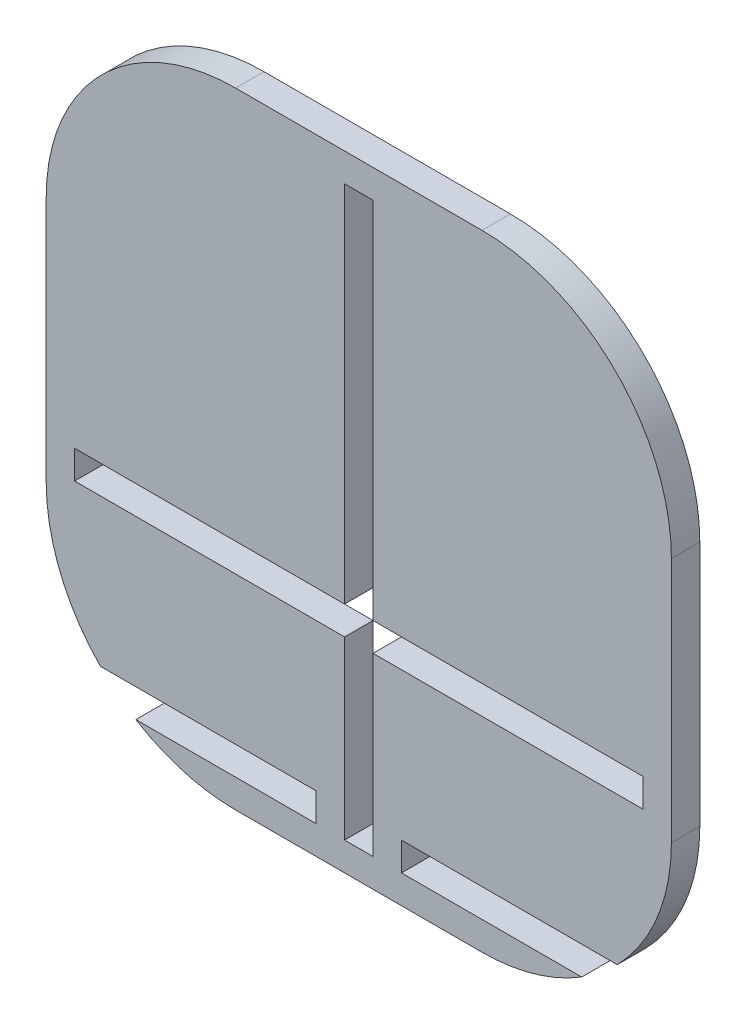
ISO-10303-21;
HEADER;
FILE_DESCRIPTION(('STEP AP214'),'2;1');
FILE_NAME('part.step','',(''),(''),'','','');
FILE_SCHEMA(('AUTOMOTIVE_DESIGN { 1 0 10303 214 1 1 1 1 }'));
ENDSEC;
DATA;
#1=APPLICATION_CONTEXT('core data for automotive mechanical design processes');
#2=APPLICATION_PROTOCOL_DEFINITION('international standard','automotive_design',2000,#1);
#3=PRODUCT_CONTEXT('',#1,'mechanical');
#4=PRODUCT('Part','Part','',(#3));
#5=PRODUCT_RELATED_PRODUCT_CATEGORY('part','',(#4));
#6=PRODUCT_DEFINITION_FORMATION('','',#4);
#7=PRODUCT_DEFINITION_CONTEXT('part definition',#1,'design');
#8=PRODUCT_DEFINITION('design','',#6,#7);
#9=PRODUCT_DEFINITION_SHAPE('','',#8);
#10=(LENGTH_UNIT() NAMED_UNIT(*) SI_UNIT(.MILLI.,.METRE.));
#11=(NAMED_UNIT(*) PLANE_ANGLE_UNIT() SI_UNIT($,.RADIAN.));
#12=(NAMED_UNIT(*) SI_UNIT($,.STERADIAN.) SOLID_ANGLE_UNIT());
#13=UNCERTAINTY_MEASURE_WITH_UNIT(LENGTH_MEASURE(1.E-05),#10,'distance_accuracy_value','');
#14=(GEOMETRIC_REPRESENTATION_CONTEXT(3) GLOBAL_UNCERTAINTY_ASSIGNED_CONTEXT((#13)) GLOBAL_UNIT_ASSIGNED_CONTEXT((#10,
#11,#12)) REPRESENTATION_CONTEXT('',''));
#15=CARTESIAN_POINT('',(0.,0.,0.));
#16=DIRECTION('',(0.,0.,1.));
#17=DIRECTION('',(1.,0.,0.));
#18=AXIS2_PLACEMENT_3D('',#15,#16,#17);
#19=CARTESIAN_POINT('',(0.,33.,3.));
#20=DIRECTION('',(0.,-1.,0.));
#21=DIRECTION('',(1.,0.,0.));
#22=AXIS2_PLACEMENT_3D('',#19,#20,#21);
#23=PLANE('',#22);
#24=DIRECTION('',(-1.,0.,0.));
#25=VECTOR('',#24,1.);
#26=CARTESIAN_POINT('',(0.,33.,0.));
#27=LINE('',#26,#25);
#28=CARTESIAN_POINT('',(12.9999999999999,33.,0.));
#29=VERTEX_POINT('',#28);
#30=CARTESIAN_POINT('',(-12.9999999999999,33.,0.));
#31=VERTEX_POINT('',#30);
#32=EDGE_CURVE('E304',#29,#31,#27,.T.);
#33=ORIENTED_EDGE('',*,*,#32,.T.);
#34=DIRECTION('',(0.,0.,-1.));
#35=VECTOR('',#34,1.);
#36=CARTESIAN_POINT('',(-12.9999999999999,33.,3.));
#37=LINE('',#36,#35);
#38=CARTESIAN_POINT('',(-12.9999999999999,33.,3.));
#39=VERTEX_POINT('',#38);
#40=EDGE_CURVE('E11',#39,#31,#37,.T.);
#41=ORIENTED_EDGE('',*,*,#40,.F.);
#42=DIRECTION('',(-1.,0.,0.));
#43=VECTOR('',#42,1.);
#44=CARTESIAN_POINT('',(0.,33.,3.));
#45=LINE('',#44,#43);
#46=CARTESIAN_POINT('',(12.9999999999999,33.,3.));
#47=VERTEX_POINT('',#46);
#48=EDGE_CURVE('E506',#47,#39,#45,.T.);
#49=ORIENTED_EDGE('',*,*,#48,.F.);
#50=DIRECTION('',(0.,0.,-1.));
#51=VECTOR('',#50,1.);
#52=CARTESIAN_POINT('',(12.9999999999999,33.,3.));
#53=LINE('',#52,#51);
#54=EDGE_CURVE('E356',#47,#29,#53,.T.);
#55=ORIENTED_EDGE('',*,*,#54,.T.);
#56=EDGE_LOOP('',(#33,#41,#49,#55));
#57=FACE_BOUND('',#56,.T.);
#58=ADVANCED_FACE('F45',(#57),#23,.F.);
#59=CARTESIAN_POINT('',(-13.,13.,3.));
#60=DIRECTION('',(0.,0.,-1.));
#61=DIRECTION('',(-1.,0.,0.));
#62=AXIS2_PLACEMENT_3D('',#59,#60,#61);
#63=CYLINDRICAL_SURFACE('',#62,20.);
#64=CARTESIAN_POINT('',(-13.,13.,0.));
#65=DIRECTION('',(0.,0.,1.));
#66=DIRECTION('',(1.,0.,0.));
#67=AXIS2_PLACEMENT_3D('',#64,#65,#66);
#68=CIRCLE('',#67,20.);
#69=CARTESIAN_POINT('',(-33.,12.9999999999998,0.));
#70=VERTEX_POINT('',#69);
#71=EDGE_CURVE('E308',#31,#70,#68,.T.);
#72=ORIENTED_EDGE('',*,*,#71,.T.);
#73=DIRECTION('',(0.,0.,-1.));
#74=VECTOR('',#73,1.);
#75=CARTESIAN_POINT('',(-33.,12.9999999999998,3.));
#76=LINE('',#75,#74);
#77=CARTESIAN_POINT('',(-33.,12.9999999999998,3.));
#78=VERTEX_POINT('',#77);
#79=EDGE_CURVE('E56',#78,#70,#76,.T.);
#80=ORIENTED_EDGE('',*,*,#79,.F.);
#81=CARTESIAN_POINT('',(-13.,13.,3.));
#82=DIRECTION('',(0.,0.,1.));
#83=DIRECTION('',(1.,0.,0.));
#84=AXIS2_PLACEMENT_3D('',#81,#82,#83);
#85=CIRCLE('',#84,20.);
#86=EDGE_CURVE('E509',#39,#78,#85,.T.);
#87=ORIENTED_EDGE('',*,*,#86,.F.);
#88=ORIENTED_EDGE('',*,*,#40,.T.);
#89=EDGE_LOOP('',(#72,#80,#87,#88));
#90=FACE_BOUND('',#89,.T.);
#91=ADVANCED_FACE('F582',(#90),#63,.T.);
#92=CARTESIAN_POINT('',(-33.,0.,3.));
#93=DIRECTION('',(-1.,0.,0.));
#94=DIRECTION('',(0.,0.,1.));
#95=AXIS2_PLACEMENT_3D('',#92,#93,#94);
#96=PLANE('',#95);
#97=DIRECTION('',(0.,1.,0.));
#98=VECTOR('',#97,1.);
#99=CARTESIAN_POINT('',(-33.,0.,0.));
#100=LINE('',#99,#98);
#101=CARTESIAN_POINT('',(-33.,-12.9999999999999,0.));
#102=VERTEX_POINT('',#101);
#103=EDGE_CURVE('E312',#102,#70,#100,.T.);
#104=ORIENTED_EDGE('',*,*,#103,.F.);
#105=DIRECTION('',(0.,0.,-1.));
#106=VECTOR('',#105,1.);
#107=CARTESIAN_POINT('',(-33.,-12.9999999999999,3.));
#108=LINE('',#107,#106);
#109=CARTESIAN_POINT('',(-33.,-12.9999999999999,3.));
#110=VERTEX_POINT('',#109);
#111=EDGE_CURVE('E392',#110,#102,#108,.T.);
#112=ORIENTED_EDGE('',*,*,#111,.F.);
#113=DIRECTION('',(0.,1.,0.));
#114=VECTOR('',#113,1.);
#115=CARTESIAN_POINT('',(-33.,0.,3.));
#116=LINE('',#115,#114);
#117=EDGE_CURVE('E512',#110,#78,#116,.T.);
#118=ORIENTED_EDGE('',*,*,#117,.T.);
#119=ORIENTED_EDGE('',*,*,#79,.T.);
#120=EDGE_LOOP('',(#104,#112,#118,#119));
#121=FACE_BOUND('',#120,.T.);
#122=ADVANCED_FACE('F578',(#121),#96,.T.);
#123=CARTESIAN_POINT('',(-13.,-13.,3.));
#124=DIRECTION('',(0.,0.,-1.));
#125=DIRECTION('',(-1.,0.,0.));
#126=AXIS2_PLACEMENT_3D('',#123,#124,#125);
#127=CYLINDRICAL_SURFACE('',#126,20.);
#128=CARTESIAN_POINT('',(-13.,-13.,0.));
#129=DIRECTION('',(0.,0.,1.));
#130=DIRECTION('',(1.,0.,0.));
#131=AXIS2_PLACEMENT_3D('',#128,#129,#130);
#132=CIRCLE('',#131,20.);
#133=CARTESIAN_POINT('',(-27.2828568570857,-27.,0.));
#134=VERTEX_POINT('',#133);
#135=EDGE_CURVE('E316',#134,#102,#132,.F.);
#136=ORIENTED_EDGE('',*,*,#135,.F.);
#137=DIRECTION('',(0.,0.,-1.));
#138=VECTOR('',#137,1.);
#139=CARTESIAN_POINT('',(-27.2828568570857,-27.,3.));
#140=LINE('',#139,#138);
#141=CARTESIAN_POINT('',(-27.2828568570857,-27.,3.));
#142=VERTEX_POINT('',#141);
#143=EDGE_CURVE('E389',#142,#134,#140,.T.);
#144=ORIENTED_EDGE('',*,*,#143,.F.);
#145=CARTESIAN_POINT('',(-13.,-13.,3.));
#146=DIRECTION('',(0.,0.,1.));
#147=DIRECTION('',(1.,0.,0.));
#148=AXIS2_PLACEMENT_3D('',#145,#146,#147);
#149=CIRCLE('',#148,20.);
#150=EDGE_CURVE('E516',#142,#110,#149,.F.);
#151=ORIENTED_EDGE('',*,*,#150,.T.);
#152=ORIENTED_EDGE('',*,*,#111,.T.);
#153=EDGE_LOOP('',(#136,#144,#151,#152));
#154=FACE_BOUND('',#153,.T.);
#155=ADVANCED_FACE('F572',(#154),#127,.T.);
#156=CARTESIAN_POINT('',(0.,-27.,3.));
#157=DIRECTION('',(0.,1.,0.));
#158=DIRECTION('',(-1.,0.,0.));
#159=AXIS2_PLACEMENT_3D('',#156,#157,#158);
#160=PLANE('',#159);
#161=DIRECTION('',(1.,0.,0.));
#162=VECTOR('',#161,1.);
#163=CARTESIAN_POINT('',(0.,-27.,0.));
#164=LINE('',#163,#162);
#165=CARTESIAN_POINT('',(-4.50285685708569,-27.,0.));
#166=VERTEX_POINT('',#165);
#167=EDGE_CURVE('E320',#134,#166,#164,.T.);
#168=ORIENTED_EDGE('',*,*,#167,.T.);
#169=DIRECTION('',(0.,0.,-1.));
#170=VECTOR('',#169,1.);
#171=CARTESIAN_POINT('',(-4.50285685708569,-27.,3.));
#172=LINE('',#171,#170);
#173=CARTESIAN_POINT('',(-4.50285685708569,-27.,3.));
#174=VERTEX_POINT('',#173);
#175=EDGE_CURVE('E385',#174,#166,#172,.T.);
#176=ORIENTED_EDGE('',*,*,#175,.F.);
#177=DIRECTION('',(1.,0.,0.));
#178=VECTOR('',#177,1.);
#179=CARTESIAN_POINT('',(0.,-27.,3.));
#180=LINE('',#179,#178);
#181=EDGE_CURVE('E520',#142,#174,#180,.T.);
#182=ORIENTED_EDGE('',*,*,#181,.F.);
#183=ORIENTED_EDGE('',*,*,#143,.T.);
#184=EDGE_LOOP('',(#168,#176,#182,#183));
#185=FACE_BOUND('',#184,.T.);
#186=ADVANCED_FACE('F825',(#185),#160,.F.);
#187=CARTESIAN_POINT('',(-4.50285685708569,0.,3.));
#188=DIRECTION('',(1.,0.,0.));
#189=DIRECTION('',(0.,0.,-1.));
#190=AXIS2_PLACEMENT_3D('',#187,#188,#189);
#191=PLANE('',#190);
#192=DIRECTION('',(0.,-1.,0.));
#193=VECTOR('',#192,1.);
#194=CARTESIAN_POINT('',(-4.50285685708569,0.,0.));
#195=LINE('',#194,#193);
#196=CARTESIAN_POINT('',(-4.50285685708569,-30.,0.));
#197=VERTEX_POINT('',#196);
#198=EDGE_CURVE('E324',#166,#197,#195,.T.);
#199=ORIENTED_EDGE('',*,*,#198,.T.);
#200=DIRECTION('',(0.,0.,-1.));
#201=VECTOR('',#200,1.);
#202=CARTESIAN_POINT('',(-4.50285685708569,-30.,3.));
#203=LINE('',#202,#201);
#204=CARTESIAN_POINT('',(-4.50285685708569,-30.,3.));
#205=VERTEX_POINT('',#204);
#206=EDGE_CURVE('E382',#205,#197,#203,.T.);
#207=ORIENTED_EDGE('',*,*,#206,.F.);
#208=DIRECTION('',(0.,-1.,0.));
#209=VECTOR('',#208,1.);
#210=CARTESIAN_POINT('',(-4.50285685708569,0.,3.));
#211=LINE('',#210,#209);
#212=EDGE_CURVE('E524',#174,#205,#211,.T.);
#213=ORIENTED_EDGE('',*,*,#212,.F.);
#214=ORIENTED_EDGE('',*,*,#175,.T.);
#215=EDGE_LOOP('',(#199,#207,#213,#214));
#216=FACE_BOUND('',#215,.T.);
#217=ADVANCED_FACE('F566',(#216),#191,.F.);
#218=CARTESIAN_POINT('',(0.,-30.,3.));
#219=DIRECTION('',(0.,1.,0.));
#220=DIRECTION('',(-1.,0.,0.));
#221=AXIS2_PLACEMENT_3D('',#218,#219,#220);
#222=PLANE('',#221);
#223=DIRECTION('',(1.,0.,0.));
#224=VECTOR('',#223,1.);
#225=CARTESIAN_POINT('',(0.,-30.,0.));
#226=LINE('',#225,#224);
#227=CARTESIAN_POINT('',(-23.5356537528527,-30.,0.));
#228=VERTEX_POINT('',#227);
#229=EDGE_CURVE('E328',#228,#197,#226,.T.);
#230=ORIENTED_EDGE('',*,*,#229,.F.);
#231=DIRECTION('',(0.,0.,-1.));
#232=VECTOR('',#231,1.);
#233=CARTESIAN_POINT('',(-23.5356537528527,-30.,3.));
#234=LINE('',#233,#232);
#235=CARTESIAN_POINT('',(-23.5356537528527,-30.,3.));
#236=VERTEX_POINT('',#235);
#237=EDGE_CURVE('E379',#236,#228,#234,.T.);
#238=ORIENTED_EDGE('',*,*,#237,.F.);
#239=DIRECTION('',(1.,0.,0.));
#240=VECTOR('',#239,1.);
#241=CARTESIAN_POINT('',(0.,-30.,3.));
#242=LINE('',#241,#240);
#243=EDGE_CURVE('E527',#236,#205,#242,.T.);
#244=ORIENTED_EDGE('',*,*,#243,.T.);
#245=ORIENTED_EDGE('',*,*,#206,.T.);
#246=EDGE_LOOP('',(#230,#238,#244,#245));
#247=FACE_BOUND('',#246,.T.);
#248=ADVANCED_FACE('F562',(#247),#222,.T.);
#249=CARTESIAN_POINT('',(-12.9999999999999,-33.,0.));
#250=VERTEX_POINT('',#249);
#251=EDGE_CURVE('E321',#250,#228,#132,.F.);
#252=ORIENTED_EDGE('',*,*,#251,.F.);
#253=DIRECTION('',(0.,0.,-1.));
#254=VECTOR('',#253,1.);
#255=CARTESIAN_POINT('',(-12.9999999999999,-33.,3.));
#256=LINE('',#255,#254);
#257=CARTESIAN_POINT('',(-12.9999999999999,-33.,3.));
#258=VERTEX_POINT('',#257);
#259=EDGE_CURVE('E376',#258,#250,#256,.T.);
#260=ORIENTED_EDGE('',*,*,#259,.F.);
#261=EDGE_CURVE('E521',#258,#236,#149,.F.);
#262=ORIENTED_EDGE('',*,*,#261,.T.);
#263=ORIENTED_EDGE('',*,*,#237,.T.);
#264=EDGE_LOOP('',(#252,#260,#262,#263));
#265=FACE_BOUND('',#264,.T.);
#266=ADVANCED_FACE('F557',(#265),#127,.T.);
#267=CARTESIAN_POINT('',(0.,-33.,3.));
#268=DIRECTION('',(0.,-1.,0.));
#269=DIRECTION('',(1.,0.,0.));
#270=AXIS2_PLACEMENT_3D('',#267,#268,#269);
#271=PLANE('',#270);
#272=DIRECTION('',(-1.,0.,0.));
#273=VECTOR('',#272,1.);
#274=CARTESIAN_POINT('',(0.,-33.,0.));
#275=LINE('',#274,#273);
#276=CARTESIAN_POINT('',(12.9999999999999,-33.,0.));
#277=VERTEX_POINT('',#276);
#278=EDGE_CURVE('E332',#277,#250,#275,.T.);
#279=ORIENTED_EDGE('',*,*,#278,.F.);
#280=DIRECTION('',(0.,0.,-1.));
#281=VECTOR('',#280,1.);
#282=CARTESIAN_POINT('',(12.9999999999999,-33.,3.));
#283=LINE('',#282,#281);
#284=CARTESIAN_POINT('',(12.9999999999999,-33.,3.));
#285=VERTEX_POINT('',#284);
#286=EDGE_CURVE('E373',#285,#277,#283,.T.);
#287=ORIENTED_EDGE('',*,*,#286,.F.);
#288=DIRECTION('',(-1.,0.,0.));
#289=VECTOR('',#288,1.);
#290=CARTESIAN_POINT('',(0.,-33.,3.));
#291=LINE('',#290,#289);
#292=EDGE_CURVE('E531',#285,#258,#291,.T.);
#293=ORIENTED_EDGE('',*,*,#292,.T.);
#294=ORIENTED_EDGE('',*,*,#259,.T.);
#295=EDGE_LOOP('',(#279,#287,#293,#294));
#296=FACE_BOUND('',#295,.T.);
#297=ADVANCED_FACE('F791',(#296),#271,.T.);
#298=CARTESIAN_POINT('',(13.,-13.,3.));
#299=DIRECTION('',(0.,0.,-1.));
#300=DIRECTION('',(-1.,0.,0.));
#301=AXIS2_PLACEMENT_3D('',#298,#299,#300);
#302=CYLINDRICAL_SURFACE('',#301,20.);
#303=CARTESIAN_POINT('',(13.,-13.,0.));
#304=DIRECTION('',(0.,0.,1.));
#305=DIRECTION('',(1.,0.,0.));
#306=AXIS2_PLACEMENT_3D('',#303,#304,#305);
#307=CIRCLE('',#306,20.);
#308=CARTESIAN_POINT('',(23.5356537528527,-30.,0.));
#309=VERTEX_POINT('',#308);
#310=EDGE_CURVE('E336',#277,#309,#307,.T.);
#311=ORIENTED_EDGE('',*,*,#310,.T.);
#312=DIRECTION('',(0.,0.,-1.));
#313=VECTOR('',#312,1.);
#314=CARTESIAN_POINT('',(23.5356537528527,-30.,3.));
#315=LINE('',#314,#313);
#316=CARTESIAN_POINT('',(23.5356537528527,-30.,3.));
#317=VERTEX_POINT('',#316);
#318=EDGE_CURVE('E369',#317,#309,#315,.T.);
#319=ORIENTED_EDGE('',*,*,#318,.F.);
#320=CARTESIAN_POINT('',(13.,-13.,3.));
#321=DIRECTION('',(0.,0.,1.));
#322=DIRECTION('',(1.,0.,0.));
#323=AXIS2_PLACEMENT_3D('',#320,#321,#322);
#324=CIRCLE('',#323,20.);
#325=EDGE_CURVE('E255',#285,#317,#324,.T.);
#326=ORIENTED_EDGE('',*,*,#325,.F.);
#327=ORIENTED_EDGE('',*,*,#286,.T.);
#328=EDGE_LOOP('',(#311,#319,#326,#327));
#329=FACE_BOUND('',#328,.T.);
#330=ADVANCED_FACE('F756',(#329),#302,.T.);
#331=CARTESIAN_POINT('',(0.,-30.,3.));
#332=DIRECTION('',(0.,-1.,0.));
#333=DIRECTION('',(1.,0.,0.));
#334=AXIS2_PLACEMENT_3D('',#331,#332,#333);
#335=PLANE('',#334);
#336=DIRECTION('',(-1.,0.,0.));
#337=VECTOR('',#336,1.);
#338=CARTESIAN_POINT('',(0.,-30.,0.));
#339=LINE('',#338,#337);
#340=CARTESIAN_POINT('',(4.5028568570857,-30.,0.));
#341=VERTEX_POINT('',#340);
#342=EDGE_CURVE('E339',#309,#341,#339,.T.);
#343=ORIENTED_EDGE('',*,*,#342,.T.);
#344=DIRECTION('',(0.,0.,-1.));
#345=VECTOR('',#344,1.);
#346=CARTESIAN_POINT('',(4.5028568570857,-30.,3.));
#347=LINE('',#346,#345);
#348=CARTESIAN_POINT('',(4.5028568570857,-30.,3.));
#349=VERTEX_POINT('',#348);
#350=EDGE_CURVE('E366',#349,#341,#347,.T.);
#351=ORIENTED_EDGE('',*,*,#350,.F.);
#352=DIRECTION('',(-1.,0.,0.));
#353=VECTOR('',#352,1.);
#354=CARTESIAN_POINT('',(0.,-30.,3.));
#355=LINE('',#354,#353);
#356=EDGE_CURVE('E536',#317,#349,#355,.T.);
#357=ORIENTED_EDGE('',*,*,#356,.F.);
#358=ORIENTED_EDGE('',*,*,#318,.T.);
#359=EDGE_LOOP('',(#343,#351,#357,#358));
#360=FACE_BOUND('',#359,.T.);
#361=ADVANCED_FACE('F773',(#360),#335,.F.);
#362=CARTESIAN_POINT('',(4.5028568570857,0.,3.));
#363=DIRECTION('',(1.,0.,0.));
#364=DIRECTION('',(0.,0.,-1.));
#365=AXIS2_PLACEMENT_3D('',#362,#363,#364);
#366=PLANE('',#365);
#367=DIRECTION('',(0.,-1.,0.));
#368=VECTOR('',#367,1.);
#369=CARTESIAN_POINT('',(4.5028568570857,0.,0.));
#370=LINE('',#369,#368);
#371=CARTESIAN_POINT('',(4.5028568570857,-27.,0.));
#372=VERTEX_POINT('',#371);
#373=EDGE_CURVE('E343',#372,#341,#370,.T.);
#374=ORIENTED_EDGE('',*,*,#373,.F.);
#375=DIRECTION('',(0.,0.,-1.));
#376=VECTOR('',#375,1.);
#377=CARTESIAN_POINT('',(4.5028568570857,-27.,3.));
#378=LINE('',#377,#376);
#379=CARTESIAN_POINT('',(4.5028568570857,-27.,3.));
#380=VERTEX_POINT('',#379);
#381=EDGE_CURVE('E363',#380,#372,#378,.T.);
#382=ORIENTED_EDGE('',*,*,#381,.F.);
#383=DIRECTION('',(0.,-1.,0.));
#384=VECTOR('',#383,1.);
#385=CARTESIAN_POINT('',(4.5028568570857,0.,3.));
#386=LINE('',#385,#384);
#387=EDGE_CURVE('E538',#380,#349,#386,.T.);
#388=ORIENTED_EDGE('',*,*,#387,.T.);
#389=ORIENTED_EDGE('',*,*,#350,.T.);
#390=EDGE_LOOP('',(#374,#382,#388,#389));
#391=FACE_BOUND('',#390,.T.);
#392=ADVANCED_FACE('F764',(#391),#366,.T.);
#393=CARTESIAN_POINT('',(0.,-27.,3.));
#394=DIRECTION('',(0.,-1.,0.));
#395=DIRECTION('',(1.,0.,0.));
#396=AXIS2_PLACEMENT_3D('',#393,#394,#395);
#397=PLANE('',#396);
#398=DIRECTION('',(-1.,0.,0.));
#399=VECTOR('',#398,1.);
#400=CARTESIAN_POINT('',(0.,-27.,0.));
#401=LINE('',#400,#399);
#402=CARTESIAN_POINT('',(27.2828568570857,-27.,0.));
#403=VERTEX_POINT('',#402);
#404=EDGE_CURVE('E347',#403,#372,#401,.T.);
#405=ORIENTED_EDGE('',*,*,#404,.F.);
#406=DIRECTION('',(0.,0.,-1.));
#407=VECTOR('',#406,1.);
#408=CARTESIAN_POINT('',(27.2828568570857,-27.,3.));
#409=LINE('',#408,#407);
#410=CARTESIAN_POINT('',(27.2828568570857,-27.,3.));
#411=VERTEX_POINT('',#410);
#412=EDGE_CURVE('E261',#411,#403,#409,.T.);
#413=ORIENTED_EDGE('',*,*,#412,.F.);
#414=DIRECTION('',(-1.,0.,0.));
#415=VECTOR('',#414,1.);
#416=CARTESIAN_POINT('',(0.,-27.,3.));
#417=LINE('',#416,#415);
#418=EDGE_CURVE('E251',#411,#380,#417,.T.);
#419=ORIENTED_EDGE('',*,*,#418,.T.);
#420=ORIENTED_EDGE('',*,*,#381,.T.);
#421=EDGE_LOOP('',(#405,#413,#419,#420));
#422=FACE_BOUND('',#421,.T.);
#423=ADVANCED_FACE('F545',(#422),#397,.T.);
#424=CARTESIAN_POINT('',(33.,-12.9999999999999,0.));
#425=VERTEX_POINT('',#424);
#426=EDGE_CURVE('E259',#403,#425,#307,.T.);
#427=ORIENTED_EDGE('',*,*,#426,.T.);
#428=DIRECTION('',(0.,0.,-1.));
#429=VECTOR('',#428,1.);
#430=CARTESIAN_POINT('',(33.,-12.9999999999999,3.));
#431=LINE('',#430,#429);
#432=CARTESIAN_POINT('',(33.,-12.9999999999999,3.));
#433=VERTEX_POINT('',#432);
#434=EDGE_CURVE('E256',#433,#425,#431,.T.);
#435=ORIENTED_EDGE('',*,*,#434,.F.);
#436=EDGE_CURVE('E244',#411,#433,#324,.T.);
#437=ORIENTED_EDGE('',*,*,#436,.F.);
#438=ORIENTED_EDGE('',*,*,#412,.T.);
#439=EDGE_LOOP('',(#427,#435,#437,#438));
#440=FACE_BOUND('',#439,.T.);
#441=ADVANCED_FACE('F257',(#440),#302,.T.);
#442=CARTESIAN_POINT('',(33.,0.,3.));
#443=DIRECTION('',(-1.,0.,0.));
#444=DIRECTION('',(0.,0.,1.));
#445=AXIS2_PLACEMENT_3D('',#442,#443,#444);
#446=PLANE('',#445);
#447=DIRECTION('',(0.,1.,0.));
#448=VECTOR('',#447,1.);
#449=CARTESIAN_POINT('',(33.,0.,0.));
#450=LINE('',#449,#448);
#451=CARTESIAN_POINT('',(33.,12.9999999999999,0.));
#452=VERTEX_POINT('',#451);
#453=EDGE_CURVE('E154',#425,#452,#450,.T.);
#454=ORIENTED_EDGE('',*,*,#453,.T.);
#455=DIRECTION('',(0.,0.,-1.));
#456=VECTOR('',#455,1.);
#457=CARTESIAN_POINT('',(33.,12.9999999999999,3.));
#458=LINE('',#457,#456);
#459=CARTESIAN_POINT('',(33.,12.9999999999999,3.));
#460=VERTEX_POINT('',#459);
#461=EDGE_CURVE('E262',#460,#452,#458,.T.);
#462=ORIENTED_EDGE('',*,*,#461,.F.);
#463=DIRECTION('',(0.,1.,0.));
#464=VECTOR('',#463,1.);
#465=CARTESIAN_POINT('',(33.,0.,3.));
#466=LINE('',#465,#464);
#467=EDGE_CURVE('E248',#433,#460,#466,.T.);
#468=ORIENTED_EDGE('',*,*,#467,.F.);
#469=ORIENTED_EDGE('',*,*,#434,.T.);
#470=EDGE_LOOP('',(#454,#462,#468,#469));
#471=FACE_BOUND('',#470,.T.);
#472=ADVANCED_FACE('F264',(#471),#446,.F.);
#473=CARTESIAN_POINT('',(0.,30.,3.));
#474=DIRECTION('',(0.,1.,0.));
#475=DIRECTION('',(0.,0.,1.));
#476=AXIS2_PLACEMENT_3D('',#473,#474,#475);
#477=PLANE('',#476);
#478=DIRECTION('',(1.,0.,0.));
#479=VECTOR('',#478,1.);
#480=CARTESIAN_POINT('',(0.,30.,0.));
#481=LINE('',#480,#479);
#482=CARTESIAN_POINT('',(-1.50000000000001,30.,0.));
#483=VERTEX_POINT('',#482);
#484=CARTESIAN_POINT('',(1.50000000000001,30.,0.));
#485=VERTEX_POINT('',#484);
#486=EDGE_CURVE('E273',#483,#485,#481,.T.);
#487=ORIENTED_EDGE('',*,*,#486,.T.);
#488=DIRECTION('',(0.,0.,-1.));
#489=VECTOR('',#488,1.);
#490=CARTESIAN_POINT('',(1.50000000000001,30.,3.));
#491=LINE('',#490,#489);
#492=CARTESIAN_POINT('',(1.50000000000001,30.,3.));
#493=VERTEX_POINT('',#492);
#494=EDGE_CURVE('E49',#493,#485,#491,.T.);
#495=ORIENTED_EDGE('',*,*,#494,.F.);
#496=DIRECTION('',(1.,0.,0.));
#497=VECTOR('',#496,1.);
#498=CARTESIAN_POINT('',(0.,30.,3.));
#499=LINE('',#498,#497);
#500=CARTESIAN_POINT('',(-1.50000000000001,30.,3.));
#501=VERTEX_POINT('',#500);
#502=EDGE_CURVE('E355',#501,#493,#499,.T.);
#503=ORIENTED_EDGE('',*,*,#502,.F.);
#504=DIRECTION('',(0.,0.,-1.));
#505=VECTOR('',#504,1.);
#506=CARTESIAN_POINT('',(-1.50000000000001,30.,3.));
#507=LINE('',#506,#505);
#508=EDGE_CURVE('E268',#501,#483,#507,.T.);
#509=ORIENTED_EDGE('',*,*,#508,.T.);
#510=EDGE_LOOP('',(#487,#495,#503,#509));
#511=FACE_BOUND('',#510,.T.);
#512=ADVANCED_FACE('F47',(#511),#477,.F.);
#513=CARTESIAN_POINT('',(1.50000000000001,0.,3.));
#514=DIRECTION('',(1.,0.,0.));
#515=DIRECTION('',(0.,0.,-1.));
#516=AXIS2_PLACEMENT_3D('',#513,#514,#515);
#517=PLANE('',#516);
#518=DIRECTION('',(0.,-1.,0.));
#519=VECTOR('',#518,1.);
#520=CARTESIAN_POINT('',(1.50000000000001,0.,0.));
#521=LINE('',#520,#519);
#522=CARTESIAN_POINT('',(1.50000000000001,-8.42500000000001,0.));
#523=VERTEX_POINT('',#522);
#524=EDGE_CURVE('E277',#485,#523,#521,.T.);
#525=ORIENTED_EDGE('',*,*,#524,.T.);
#526=DIRECTION('',(0.,0.,-1.));
#527=VECTOR('',#526,1.);
#528=CARTESIAN_POINT('',(1.50000000000001,-8.42500000000001,3.));
#529=LINE('',#528,#527);
#530=CARTESIAN_POINT('',(1.50000000000001,-8.42500000000001,3.));
#531=VERTEX_POINT('',#530);
#532=EDGE_CURVE('E430',#531,#523,#529,.T.);
#533=ORIENTED_EDGE('',*,*,#532,.F.);
#534=DIRECTION('',(0.,-1.,0.));
#535=VECTOR('',#534,1.);
#536=CARTESIAN_POINT('',(1.50000000000001,0.,3.));
#537=LINE('',#536,#535);
#538=EDGE_CURVE('E169',#493,#531,#537,.T.);
#539=ORIENTED_EDGE('',*,*,#538,.F.);
#540=ORIENTED_EDGE('',*,*,#494,.T.);
#541=EDGE_LOOP('',(#525,#533,#539,#540));
#542=FACE_BOUND('',#541,.T.);
#543=ADVANCED_FACE('F438',(#542),#517,.F.);
#544=CARTESIAN_POINT('',(0.,-8.42500000000001,3.));
#545=DIRECTION('',(0.,1.,0.));
#546=DIRECTION('',(0.,0.,1.));
#547=AXIS2_PLACEMENT_3D('',#544,#545,#546);
#548=PLANE('',#547);
#549=DIRECTION('',(1.,0.,0.));
#550=VECTOR('',#549,1.);
#551=CARTESIAN_POINT('',(0.,-8.42500000000001,0.));
#552=LINE('',#551,#550);
#553=CARTESIAN_POINT('',(30.,-8.42500000000001,0.));
#554=VERTEX_POINT('',#553);
#555=EDGE_CURVE('E280',#523,#554,#552,.T.);
#556=ORIENTED_EDGE('',*,*,#555,.T.);
#557=DIRECTION('',(0.,0.,-1.));
#558=VECTOR('',#557,1.);
#559=CARTESIAN_POINT('',(30.,-8.42500000000001,3.));
#560=LINE('',#559,#558);
#561=CARTESIAN_POINT('',(30.,-8.42500000000001,3.));
#562=VERTEX_POINT('',#561);
#563=EDGE_CURVE('E427',#562,#554,#560,.T.);
#564=ORIENTED_EDGE('',*,*,#563,.F.);
#565=DIRECTION('',(1.,0.,0.));
#566=VECTOR('',#565,1.);
#567=CARTESIAN_POINT('',(0.,-8.42500000000001,3.));
#568=LINE('',#567,#566);
#569=EDGE_CURVE('E632',#531,#562,#568,.T.);
#570=ORIENTED_EDGE('',*,*,#569,.F.);
#571=ORIENTED_EDGE('',*,*,#532,.T.);
#572=EDGE_LOOP('',(#556,#564,#570,#571));
#573=FACE_BOUND('',#572,.T.);
#574=ADVANCED_FACE('F607',(#573),#548,.F.);
#575=CARTESIAN_POINT('',(30.,0.,3.));
#576=DIRECTION('',(1.,0.,0.));
#577=DIRECTION('',(0.,0.,-1.));
#578=AXIS2_PLACEMENT_3D('',#575,#576,#577);
#579=PLANE('',#578);
#580=DIRECTION('',(0.,-1.,0.));
#581=VECTOR('',#580,1.);
#582=CARTESIAN_POINT('',(30.,0.,0.));
#583=LINE('',#582,#581);
#584=CARTESIAN_POINT('',(30.,-11.425,0.));
#585=VERTEX_POINT('',#584);
#586=EDGE_CURVE('E284',#554,#585,#583,.T.);
#587=ORIENTED_EDGE('',*,*,#586,.T.);
#588=DIRECTION('',(0.,0.,-1.));
#589=VECTOR('',#588,1.);
#590=CARTESIAN_POINT('',(30.,-11.425,3.));
#591=LINE('',#590,#589);
#592=CARTESIAN_POINT('',(30.,-11.425,3.));
#593=VERTEX_POINT('',#592);
#594=EDGE_CURVE('E423',#593,#585,#591,.T.);
#595=ORIENTED_EDGE('',*,*,#594,.F.);
#596=DIRECTION('',(0.,-1.,0.));
#597=VECTOR('',#596,1.);
#598=CARTESIAN_POINT('',(30.,0.,3.));
#599=LINE('',#598,#597);
#600=EDGE_CURVE('E630',#562,#593,#599,.T.);
#601=ORIENTED_EDGE('',*,*,#600,.F.);
#602=ORIENTED_EDGE('',*,*,#563,.T.);
#603=EDGE_LOOP('',(#587,#595,#601,#602));
#604=FACE_BOUND('',#603,.T.);
#605=ADVANCED_FACE('F616',(#604),#579,.F.);
#606=CARTESIAN_POINT('',(0.,-11.425,3.));
#607=DIRECTION('',(0.,-1.,0.));
#608=DIRECTION('',(0.,0.,-1.));
#609=AXIS2_PLACEMENT_3D('',#606,#607,#608);
#610=PLANE('',#609);
#611=DIRECTION('',(-1.,0.,0.));
#612=VECTOR('',#611,1.);
#613=CARTESIAN_POINT('',(0.,-11.425,0.));
#614=LINE('',#613,#612);
#615=CARTESIAN_POINT('',(1.50000000000001,-11.425,0.));
#616=VERTEX_POINT('',#615);
#617=EDGE_CURVE('E288',#585,#616,#614,.T.);
#618=ORIENTED_EDGE('',*,*,#617,.T.);
#619=DIRECTION('',(0.,0.,-1.));
#620=VECTOR('',#619,1.);
#621=CARTESIAN_POINT('',(1.50000000000001,-11.425,3.));
#622=LINE('',#621,#620);
#623=CARTESIAN_POINT('',(1.50000000000001,-11.425,3.));
#624=VERTEX_POINT('',#623);
#625=EDGE_CURVE('E419',#624,#616,#622,.T.);
#626=ORIENTED_EDGE('',*,*,#625,.F.);
#627=DIRECTION('',(-1.,0.,0.));
#628=VECTOR('',#627,1.);
#629=CARTESIAN_POINT('',(0.,-11.425,3.));
#630=LINE('',#629,#628);
#631=EDGE_CURVE('E498',#593,#624,#630,.T.);
#632=ORIENTED_EDGE('',*,*,#631,.F.);
#633=ORIENTED_EDGE('',*,*,#594,.T.);
#634=EDGE_LOOP('',(#618,#626,#632,#633));
#635=FACE_BOUND('',#634,.T.);
#636=ADVANCED_FACE('F612',(#635),#610,.F.);
#637=CARTESIAN_POINT('',(1.50000000000001,-30.,0.));
#638=VERTEX_POINT('',#637);
#639=EDGE_CURVE('E281',#616,#638,#521,.T.);
#640=ORIENTED_EDGE('',*,*,#639,.T.);
#641=DIRECTION('',(0.,0.,-1.));
#642=VECTOR('',#641,1.);
#643=CARTESIAN_POINT('',(1.50000000000001,-30.,3.));
#644=LINE('',#643,#642);
#645=CARTESIAN_POINT('',(1.50000000000001,-30.,3.));
#646=VERTEX_POINT('',#645);
#647=EDGE_CURVE('E416',#646,#638,#644,.T.);
#648=ORIENTED_EDGE('',*,*,#647,.F.);
#649=EDGE_CURVE('E492',#624,#646,#537,.T.);
#650=ORIENTED_EDGE('',*,*,#649,.F.);
#651=ORIENTED_EDGE('',*,*,#625,.T.);
#652=EDGE_LOOP('',(#640,#648,#650,#651));
#653=FACE_BOUND('',#652,.T.);
#654=ADVANCED_FACE('F478',(#653),#517,.F.);
#655=CARTESIAN_POINT('',(0.,-30.,3.));
#656=DIRECTION('',(0.,1.,0.));
#657=DIRECTION('',(0.,0.,1.));
#658=AXIS2_PLACEMENT_3D('',#655,#656,#657);
#659=PLANE('',#658);
#660=DIRECTION('',(1.,0.,0.));
#661=VECTOR('',#660,1.);
#662=CARTESIAN_POINT('',(0.,-30.,0.));
#663=LINE('',#662,#661);
#664=CARTESIAN_POINT('',(-1.50000000000001,-30.,0.));
#665=VERTEX_POINT('',#664);
#666=EDGE_CURVE('E292',#665,#638,#663,.T.);
#667=ORIENTED_EDGE('',*,*,#666,.F.);
#668=DIRECTION('',(0.,0.,-1.));
#669=VECTOR('',#668,1.);
#670=CARTESIAN_POINT('',(-1.50000000000001,-30.,3.));
#671=LINE('',#670,#669);
#672=CARTESIAN_POINT('',(-1.50000000000001,-30.,3.));
#673=VERTEX_POINT('',#672);
#674=EDGE_CURVE('E413',#673,#665,#671,.T.);
#675=ORIENTED_EDGE('',*,*,#674,.F.);
#676=DIRECTION('',(1.,0.,0.));
#677=VECTOR('',#676,1.);
#678=CARTESIAN_POINT('',(0.,-30.,3.));
#679=LINE('',#678,#677);
#680=EDGE_CURVE('E487',#673,#646,#679,.T.);
#681=ORIENTED_EDGE('',*,*,#680,.T.);
#682=ORIENTED_EDGE('',*,*,#647,.T.);
#683=EDGE_LOOP('',(#667,#675,#681,#682));
#684=FACE_BOUND('',#683,.T.);
#685=ADVANCED_FACE('F485',(#684),#659,.T.);
#686=CARTESIAN_POINT('',(-1.50000000000001,0.,3.));
#687=DIRECTION('',(1.,0.,0.));
#688=DIRECTION('',(0.,0.,-1.));
#689=AXIS2_PLACEMENT_3D('',#686,#687,#688);
#690=PLANE('',#689);
#691=DIRECTION('',(0.,-1.,0.));
#692=VECTOR('',#691,1.);
#693=CARTESIAN_POINT('',(-1.50000000000001,0.,0.));
#694=LINE('',#693,#692);
#695=CARTESIAN_POINT('',(-1.50000000000001,-11.425,0.));
#696=VERTEX_POINT('',#695);
#697=EDGE_CURVE('E296',#696,#665,#694,.T.);
#698=ORIENTED_EDGE('',*,*,#697,.F.);
#699=DIRECTION('',(0.,0.,-1.));
#700=VECTOR('',#699,1.);
#701=CARTESIAN_POINT('',(-1.50000000000001,-11.425,3.));
#702=LINE('',#701,#700);
#703=CARTESIAN_POINT('',(-1.50000000000001,-11.425,3.));
#704=VERTEX_POINT('',#703);
#705=EDGE_CURVE('E410',#704,#696,#702,.T.);
#706=ORIENTED_EDGE('',*,*,#705,.F.);
#707=DIRECTION('',(0.,-1.,0.));
#708=VECTOR('',#707,1.);
#709=CARTESIAN_POINT('',(-1.50000000000001,0.,3.));
#710=LINE('',#709,#708);
#711=EDGE_CURVE('E491',#704,#673,#710,.T.);
#712=ORIENTED_EDGE('',*,*,#711,.T.);
#713=ORIENTED_EDGE('',*,*,#674,.T.);
#714=EDGE_LOOP('',(#698,#706,#712,#713));
#715=FACE_BOUND('',#714,.T.);
#716=ADVANCED_FACE('F594',(#715),#690,.T.);
#717=CARTESIAN_POINT('',(-30.,-11.425,0.));
#718=VERTEX_POINT('',#717);
#719=EDGE_CURVE('E291',#696,#718,#614,.T.);
#720=ORIENTED_EDGE('',*,*,#719,.T.);
#721=DIRECTION('',(0.,0.,-1.));
#722=VECTOR('',#721,1.);
#723=CARTESIAN_POINT('',(-30.,-11.425,3.));
#724=LINE('',#723,#722);
#725=CARTESIAN_POINT('',(-30.,-11.425,3.));
#726=VERTEX_POINT('',#725);
#727=EDGE_CURVE('E406',#726,#718,#724,.T.);
#728=ORIENTED_EDGE('',*,*,#727,.F.);
#729=EDGE_CURVE('E470',#704,#726,#630,.T.);
#730=ORIENTED_EDGE('',*,*,#729,.F.);
#731=ORIENTED_EDGE('',*,*,#705,.T.);
#732=EDGE_LOOP('',(#720,#728,#730,#731));
#733=FACE_BOUND('',#732,.T.);
#734=ADVANCED_FACE('F469',(#733),#610,.F.);
#735=CARTESIAN_POINT('',(-30.,0.,3.));
#736=DIRECTION('',(-1.,0.,0.));
#737=DIRECTION('',(0.,0.,1.));
#738=AXIS2_PLACEMENT_3D('',#735,#736,#737);
#739=PLANE('',#738);
#740=DIRECTION('',(0.,1.,0.));
#741=VECTOR('',#740,1.);
#742=CARTESIAN_POINT('',(-30.,0.,0.));
#743=LINE('',#742,#741);
#744=CARTESIAN_POINT('',(-30.,-8.42500000000001,0.));
#745=VERTEX_POINT('',#744);
#746=EDGE_CURVE('E301',#718,#745,#743,.T.);
#747=ORIENTED_EDGE('',*,*,#746,.T.);
#748=DIRECTION('',(0.,0.,-1.));
#749=VECTOR('',#748,1.);
#750=CARTESIAN_POINT('',(-30.,-8.42500000000001,3.));
#751=LINE('',#750,#749);
#752=CARTESIAN_POINT('',(-30.,-8.42500000000001,3.));
#753=VERTEX_POINT('',#752);
#754=EDGE_CURVE('E402',#753,#745,#751,.T.);
#755=ORIENTED_EDGE('',*,*,#754,.F.);
#756=DIRECTION('',(0.,1.,0.));
#757=VECTOR('',#756,1.);
#758=CARTESIAN_POINT('',(-30.,0.,3.));
#759=LINE('',#758,#757);
#760=EDGE_CURVE('E466',#726,#753,#759,.T.);
#761=ORIENTED_EDGE('',*,*,#760,.F.);
#762=ORIENTED_EDGE('',*,*,#727,.T.);
#763=EDGE_LOOP('',(#747,#755,#761,#762));
#764=FACE_BOUND('',#763,.T.);
#765=ADVANCED_FACE('F463',(#764),#739,.F.);
#766=CARTESIAN_POINT('',(-1.50000000000001,-8.42500000000001,0.));
#767=VERTEX_POINT('',#766);
#768=EDGE_CURVE('E285',#745,#767,#552,.T.);
#769=ORIENTED_EDGE('',*,*,#768,.T.);
#770=DIRECTION('',(0.,0.,-1.));
#771=VECTOR('',#770,1.);
#772=CARTESIAN_POINT('',(-1.50000000000001,-8.42500000000001,3.));
#773=LINE('',#772,#771);
#774=CARTESIAN_POINT('',(-1.50000000000001,-8.42500000000001,3.));
#775=VERTEX_POINT('',#774);
#776=EDGE_CURVE('E399',#775,#767,#773,.T.);
#777=ORIENTED_EDGE('',*,*,#776,.F.);
#778=EDGE_CURVE('E505',#753,#775,#568,.T.);
#779=ORIENTED_EDGE('',*,*,#778,.F.);
#780=ORIENTED_EDGE('',*,*,#754,.T.);
#781=EDGE_LOOP('',(#769,#777,#779,#780));
#782=FACE_BOUND('',#781,.T.);
#783=ADVANCED_FACE('F456',(#782),#548,.F.);
#784=EDGE_CURVE('E300',#483,#767,#694,.T.);
#785=ORIENTED_EDGE('',*,*,#784,.F.);
#786=ORIENTED_EDGE('',*,*,#508,.F.);
#787=EDGE_CURVE('E497',#501,#775,#710,.T.);
#788=ORIENTED_EDGE('',*,*,#787,.T.);
#789=ORIENTED_EDGE('',*,*,#776,.T.);
#790=EDGE_LOOP('',(#785,#786,#788,#789));
#791=FACE_BOUND('',#790,.T.);
#792=ADVANCED_FACE('F449',(#791),#690,.T.);
#793=CARTESIAN_POINT('',(13.,13.,3.));
#794=DIRECTION('',(0.,0.,-1.));
#795=DIRECTION('',(-1.,0.,0.));
#796=AXIS2_PLACEMENT_3D('',#793,#794,#795);
#797=CYLINDRICAL_SURFACE('',#796,20.);
#798=CARTESIAN_POINT('',(13.,13.,0.));
#799=DIRECTION('',(0.,0.,1.));
#800=DIRECTION('',(1.,0.,0.));
#801=AXIS2_PLACEMENT_3D('',#798,#799,#800);
#802=CIRCLE('',#801,20.);
#803=EDGE_CURVE('E160',#452,#29,#802,.T.);
#804=ORIENTED_EDGE('',*,*,#803,.T.);
#805=ORIENTED_EDGE('',*,*,#54,.F.);
#806=CARTESIAN_POINT('',(13.,13.,3.));
#807=DIRECTION('',(0.,0.,1.));
#808=DIRECTION('',(1.,0.,0.));
#809=AXIS2_PLACEMENT_3D('',#806,#807,#808);
#810=CIRCLE('',#809,20.);
#811=EDGE_CURVE('E65',#460,#47,#810,.T.);
#812=ORIENTED_EDGE('',*,*,#811,.F.);
#813=ORIENTED_EDGE('',*,*,#461,.T.);
#814=EDGE_LOOP('',(#804,#805,#812,#813));
#815=FACE_BOUND('',#814,.T.);
#816=ADVANCED_FACE('F585',(#815),#797,.T.);
#817=CARTESIAN_POINT('',(0.,0.,3.));
#818=DIRECTION('',(0.,0.,1.));
#819=DIRECTION('',(1.,0.,0.));
#820=AXIS2_PLACEMENT_3D('',#817,#818,#819);
#821=PLANE('',#820);
#822=ORIENTED_EDGE('',*,*,#502,.T.);
#823=ORIENTED_EDGE('',*,*,#538,.T.);
#824=ORIENTED_EDGE('',*,*,#569,.T.);
#825=ORIENTED_EDGE('',*,*,#600,.T.);
#826=ORIENTED_EDGE('',*,*,#631,.T.);
#827=ORIENTED_EDGE('',*,*,#649,.T.);
#828=ORIENTED_EDGE('',*,*,#680,.F.);
#829=ORIENTED_EDGE('',*,*,#711,.F.);
#830=ORIENTED_EDGE('',*,*,#729,.T.);
#831=ORIENTED_EDGE('',*,*,#760,.T.);
#832=ORIENTED_EDGE('',*,*,#778,.T.);
#833=ORIENTED_EDGE('',*,*,#787,.F.);
#834=EDGE_LOOP('',(#822,#823,#824,#825,#826,#827,#828,#829,#830,#831,#832,#833));
#835=FACE_BOUND('',#834,.T.);
#836=ORIENTED_EDGE('',*,*,#48,.T.);
#837=ORIENTED_EDGE('',*,*,#86,.T.);
#838=ORIENTED_EDGE('',*,*,#117,.F.);
#839=ORIENTED_EDGE('',*,*,#150,.F.);
#840=ORIENTED_EDGE('',*,*,#181,.T.);
#841=ORIENTED_EDGE('',*,*,#212,.T.);
#842=ORIENTED_EDGE('',*,*,#243,.F.);
#843=ORIENTED_EDGE('',*,*,#261,.F.);
#844=ORIENTED_EDGE('',*,*,#292,.F.);
#845=ORIENTED_EDGE('',*,*,#325,.T.);
#846=ORIENTED_EDGE('',*,*,#356,.T.);
#847=ORIENTED_EDGE('',*,*,#387,.F.);
#848=ORIENTED_EDGE('',*,*,#418,.F.);
#849=ORIENTED_EDGE('',*,*,#436,.T.);
#850=ORIENTED_EDGE('',*,*,#467,.T.);
#851=ORIENTED_EDGE('',*,*,#811,.T.);
#852=EDGE_LOOP('',(#836,#837,#838,#839,#840,#841,#842,#843,#844,#845,#846,#847,#848,#849,#850,#851));
#853=FACE_BOUND('',#852,.T.);
#854=ADVANCED_FACE('F246',(#835,#853),#821,.T.);
#855=CARTESIAN_POINT('',(0.,0.,0.));
#856=DIRECTION('',(0.,0.,1.));
#857=DIRECTION('',(1.,0.,0.));
#858=AXIS2_PLACEMENT_3D('',#855,#856,#857);
#859=PLANE('',#858);
#860=ORIENTED_EDGE('',*,*,#486,.F.);
#861=ORIENTED_EDGE('',*,*,#784,.T.);
#862=ORIENTED_EDGE('',*,*,#768,.F.);
#863=ORIENTED_EDGE('',*,*,#746,.F.);
#864=ORIENTED_EDGE('',*,*,#719,.F.);
#865=ORIENTED_EDGE('',*,*,#697,.T.);
#866=ORIENTED_EDGE('',*,*,#666,.T.);
#867=ORIENTED_EDGE('',*,*,#639,.F.);
#868=ORIENTED_EDGE('',*,*,#617,.F.);
#869=ORIENTED_EDGE('',*,*,#586,.F.);
#870=ORIENTED_EDGE('',*,*,#555,.F.);
#871=ORIENTED_EDGE('',*,*,#524,.F.);
#872=EDGE_LOOP('',(#860,#861,#862,#863,#864,#865,#866,#867,#868,#869,#870,#871));
#873=FACE_BOUND('',#872,.T.);
#874=ORIENTED_EDGE('',*,*,#32,.F.);
#875=ORIENTED_EDGE('',*,*,#803,.F.);
#876=ORIENTED_EDGE('',*,*,#453,.F.);
#877=ORIENTED_EDGE('',*,*,#426,.F.);
#878=ORIENTED_EDGE('',*,*,#404,.T.);
#879=ORIENTED_EDGE('',*,*,#373,.T.);
#880=ORIENTED_EDGE('',*,*,#342,.F.);
#881=ORIENTED_EDGE('',*,*,#310,.F.);
#882=ORIENTED_EDGE('',*,*,#278,.T.);
#883=ORIENTED_EDGE('',*,*,#251,.T.);
#884=ORIENTED_EDGE('',*,*,#229,.T.);
#885=ORIENTED_EDGE('',*,*,#198,.F.);
#886=ORIENTED_EDGE('',*,*,#167,.F.);
#887=ORIENTED_EDGE('',*,*,#135,.T.);
#888=ORIENTED_EDGE('',*,*,#103,.T.);
#889=ORIENTED_EDGE('',*,*,#71,.F.);
#890=EDGE_LOOP('',(#874,#875,#876,#877,#878,#879,#880,#881,#882,#883,#884,#885,#886,#887,#888,#889));
#891=FACE_BOUND('',#890,.T.);
#892=ADVANCED_FACE('F445',(#873,#891),#859,.F.);
#893=CLOSED_SHELL('',(#58,#91,#122,#155,#186,#217,#248,#266,#297,#330,#361,#392,#423,#441,#472,
#512,#543,#574,#605,#636,#654,#685,#716,#734,#765,#783,#792,#816,#854,#892));
#894=MANIFOLD_SOLID_BREP('B2',#893);
#895=ADVANCED_BREP_SHAPE_REPRESENTATION('',(#18,#894),#14);
#896=SHAPE_DEFINITION_REPRESENTATION(#9,#895);
ENDSEC;
END-ISO-10303-21;
